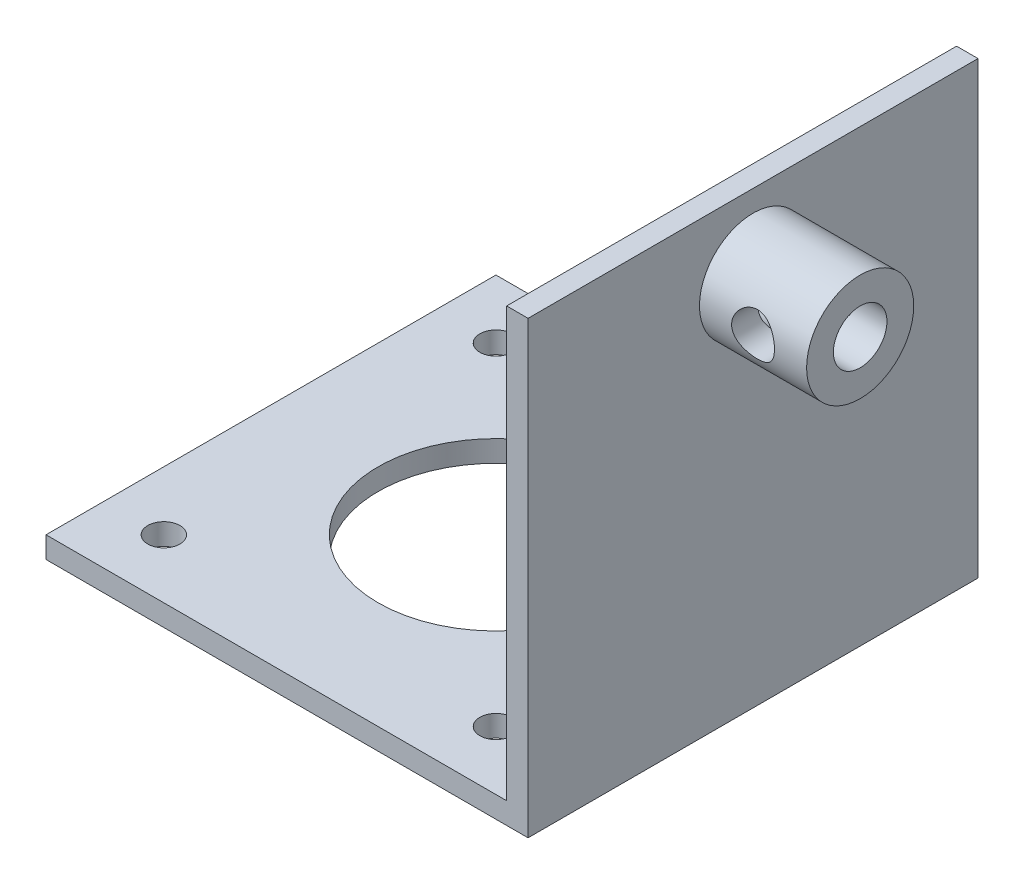
ISO-10303-21;
HEADER;
FILE_DESCRIPTION(('STEP AP214'),'2;1');
FILE_NAME('part.step','',(''),(''),'','','');
FILE_SCHEMA(('AUTOMOTIVE_DESIGN { 1 0 10303 214 1 1 1 1 }'));
ENDSEC;
DATA;
#1=APPLICATION_CONTEXT('core data for automotive mechanical design processes');
#2=APPLICATION_PROTOCOL_DEFINITION('international standard','automotive_design',2000,#1);
#3=PRODUCT_CONTEXT('',#1,'mechanical');
#4=PRODUCT('Part','Part','',(#3));
#5=PRODUCT_RELATED_PRODUCT_CATEGORY('part','',(#4));
#6=PRODUCT_DEFINITION_FORMATION('','',#4);
#7=PRODUCT_DEFINITION_CONTEXT('part definition',#1,'design');
#8=PRODUCT_DEFINITION('design','',#6,#7);
#9=PRODUCT_DEFINITION_SHAPE('','',#8);
#10=(LENGTH_UNIT() NAMED_UNIT(*) SI_UNIT(.MILLI.,.METRE.));
#11=(NAMED_UNIT(*) PLANE_ANGLE_UNIT() SI_UNIT($,.RADIAN.));
#12=(NAMED_UNIT(*) SI_UNIT($,.STERADIAN.) SOLID_ANGLE_UNIT());
#13=UNCERTAINTY_MEASURE_WITH_UNIT(LENGTH_MEASURE(1.E-05),#10,'distance_accuracy_value','');
#14=(GEOMETRIC_REPRESENTATION_CONTEXT(3) GLOBAL_UNCERTAINTY_ASSIGNED_CONTEXT((#13)) GLOBAL_UNIT_ASSIGNED_CONTEXT((#10,
#11,#12)) REPRESENTATION_CONTEXT('',''));
#15=CARTESIAN_POINT('',(0.,0.,0.));
#16=DIRECTION('',(0.,0.,1.));
#17=DIRECTION('',(1.,0.,0.));
#18=AXIS2_PLACEMENT_3D('',#15,#16,#17);
#19=CARTESIAN_POINT('',(0.,2.,0.));
#20=DIRECTION('',(0.,-1.,0.));
#21=DIRECTION('',(0.,0.,-1.));
#22=AXIS2_PLACEMENT_3D('',#19,#20,#21);
#23=PLANE('',#22);
#24=CARTESIAN_POINT('',(5.50000000000001,2.,-36.5));
#25=DIRECTION('',(0.,1.,0.));
#26=DIRECTION('',(0.,0.,1.));
#27=AXIS2_PLACEMENT_3D('',#24,#25,#26);
#28=CIRCLE('',#27,1.5);
#29=CARTESIAN_POINT('',(5.50000000000001,2.,-35.));
#30=VERTEX_POINT('',#29);
#31=EDGE_CURVE('E120',#30,#30,#28,.T.);
#32=ORIENTED_EDGE('',*,*,#31,.F.);
#33=EDGE_LOOP('',(#32));
#34=FACE_BOUND('',#33,.T.);
#35=CARTESIAN_POINT('',(21.,2.,-21.));
#36=DIRECTION('',(0.,1.,0.));
#37=DIRECTION('',(0.,0.,1.));
#38=AXIS2_PLACEMENT_3D('',#35,#36,#37);
#39=CIRCLE('',#38,11.);
#40=CARTESIAN_POINT('',(21.,2.,-10.));
#41=VERTEX_POINT('',#40);
#42=EDGE_CURVE('E257',#41,#41,#39,.T.);
#43=ORIENTED_EDGE('',*,*,#42,.F.);
#44=EDGE_LOOP('',(#43));
#45=FACE_BOUND('',#44,.T.);
#46=CARTESIAN_POINT('',(5.50000000000001,2.,-5.5));
#47=DIRECTION('',(0.,1.,0.));
#48=DIRECTION('',(0.,0.,1.));
#49=AXIS2_PLACEMENT_3D('',#46,#47,#48);
#50=CIRCLE('',#49,1.5);
#51=CARTESIAN_POINT('',(5.50000000000001,2.,-4.));
#52=VERTEX_POINT('',#51);
#53=EDGE_CURVE('E265',#52,#52,#50,.T.);
#54=ORIENTED_EDGE('',*,*,#53,.F.);
#55=EDGE_LOOP('',(#54));
#56=FACE_BOUND('',#55,.T.);
#57=CARTESIAN_POINT('',(36.5,2.,-5.5));
#58=DIRECTION('',(0.,1.,0.));
#59=DIRECTION('',(0.,0.,1.));
#60=AXIS2_PLACEMENT_3D('',#57,#58,#59);
#61=CIRCLE('',#60,1.5);
#62=CARTESIAN_POINT('',(36.5,2.,-4.));
#63=VERTEX_POINT('',#62);
#64=EDGE_CURVE('E273',#63,#63,#61,.T.);
#65=ORIENTED_EDGE('',*,*,#64,.F.);
#66=EDGE_LOOP('',(#65));
#67=FACE_BOUND('',#66,.T.);
#68=CARTESIAN_POINT('',(36.5,2.,-36.5));
#69=DIRECTION('',(0.,1.,0.));
#70=DIRECTION('',(0.,0.,1.));
#71=AXIS2_PLACEMENT_3D('',#68,#69,#70);
#72=CIRCLE('',#71,1.5);
#73=CARTESIAN_POINT('',(36.5,2.,-35.));
#74=VERTEX_POINT('',#73);
#75=EDGE_CURVE('E281',#74,#74,#72,.T.);
#76=ORIENTED_EDGE('',*,*,#75,.F.);
#77=EDGE_LOOP('',(#76));
#78=FACE_BOUND('',#77,.T.);
#79=DIRECTION('',(0.,0.,1.));
#80=VECTOR('',#79,1.);
#81=CARTESIAN_POINT('',(43.,2.,-42.));
#82=LINE('',#81,#80);
#83=CARTESIAN_POINT('',(43.,2.,-42.));
#84=VERTEX_POINT('',#83);
#85=CARTESIAN_POINT('',(43.,2.,0.));
#86=VERTEX_POINT('',#85);
#87=EDGE_CURVE('E64',#84,#86,#82,.T.);
#88=ORIENTED_EDGE('',*,*,#87,.F.);
#89=DIRECTION('',(-1.,0.,0.));
#90=VECTOR('',#89,1.);
#91=CARTESIAN_POINT('',(0.,2.,-42.));
#92=LINE('',#91,#90);
#93=CARTESIAN_POINT('',(0.,2.,-42.));
#94=VERTEX_POINT('',#93);
#95=EDGE_CURVE('E69',#84,#94,#92,.T.);
#96=ORIENTED_EDGE('',*,*,#95,.T.);
#97=DIRECTION('',(0.,0.,1.));
#98=VECTOR('',#97,1.);
#99=CARTESIAN_POINT('',(0.,2.,0.));
#100=LINE('',#99,#98);
#101=CARTESIAN_POINT('',(0.,2.,0.));
#102=VERTEX_POINT('',#101);
#103=EDGE_CURVE('E101',#94,#102,#100,.T.);
#104=ORIENTED_EDGE('',*,*,#103,.T.);
#105=DIRECTION('',(1.,0.,0.));
#106=VECTOR('',#105,1.);
#107=CARTESIAN_POINT('',(0.,2.,0.));
#108=LINE('',#107,#106);
#109=EDGE_CURVE('E292',#102,#86,#108,.T.);
#110=ORIENTED_EDGE('',*,*,#109,.T.);
#111=EDGE_LOOP('',(#88,#96,#104,#110));
#112=FACE_BOUND('',#111,.T.);
#113=ADVANCED_FACE('F41',(#34,#45,#56,#67,#78,#112),#23,.F.);
#114=CARTESIAN_POINT('',(0.,2.,0.));
#115=DIRECTION('',(1.,0.,0.));
#116=DIRECTION('',(0.,0.,-1.));
#117=AXIS2_PLACEMENT_3D('',#114,#115,#116);
#118=PLANE('',#117);
#119=DIRECTION('',(0.,0.,1.));
#120=VECTOR('',#119,1.);
#121=CARTESIAN_POINT('',(0.,0.,0.));
#122=LINE('',#121,#120);
#123=CARTESIAN_POINT('',(0.,0.,-42.));
#124=VERTEX_POINT('',#123);
#125=CARTESIAN_POINT('',(0.,0.,0.));
#126=VERTEX_POINT('',#125);
#127=EDGE_CURVE('E107',#124,#126,#122,.T.);
#128=ORIENTED_EDGE('',*,*,#127,.T.);
#129=DIRECTION('',(0.,-1.,0.));
#130=VECTOR('',#129,1.);
#131=CARTESIAN_POINT('',(0.,2.,0.));
#132=LINE('',#131,#130);
#133=EDGE_CURVE('E56',#102,#126,#132,.T.);
#134=ORIENTED_EDGE('',*,*,#133,.F.);
#135=ORIENTED_EDGE('',*,*,#103,.F.);
#136=DIRECTION('',(0.,-1.,0.));
#137=VECTOR('',#136,1.);
#138=CARTESIAN_POINT('',(0.,2.,-42.));
#139=LINE('',#138,#137);
#140=EDGE_CURVE('E92',#94,#124,#139,.T.);
#141=ORIENTED_EDGE('',*,*,#140,.T.);
#142=EDGE_LOOP('',(#128,#134,#135,#141));
#143=FACE_BOUND('',#142,.T.);
#144=ADVANCED_FACE('F43',(#143),#118,.F.);
#145=CARTESIAN_POINT('',(0.,2.,0.));
#146=DIRECTION('',(0.,0.,-1.));
#147=DIRECTION('',(-1.,0.,0.));
#148=AXIS2_PLACEMENT_3D('',#145,#146,#147);
#149=PLANE('',#148);
#150=DIRECTION('',(1.,0.,0.));
#151=VECTOR('',#150,1.);
#152=CARTESIAN_POINT('',(0.,0.,0.));
#153=LINE('',#152,#151);
#154=CARTESIAN_POINT('',(45.,0.,0.));
#155=VERTEX_POINT('',#154);
#156=EDGE_CURVE('E111',#126,#155,#153,.T.);
#157=ORIENTED_EDGE('',*,*,#156,.T.);
#158=DIRECTION('',(0.,-1.,0.));
#159=VECTOR('',#158,1.);
#160=CARTESIAN_POINT('',(45.,2.,0.));
#161=LINE('',#160,#159);
#162=CARTESIAN_POINT('',(45.,42.,0.));
#163=VERTEX_POINT('',#162);
#164=EDGE_CURVE('E129',#163,#155,#161,.T.);
#165=ORIENTED_EDGE('',*,*,#164,.F.);
#166=DIRECTION('',(1.,0.,0.));
#167=VECTOR('',#166,1.);
#168=CARTESIAN_POINT('',(43.,42.,0.));
#169=LINE('',#168,#167);
#170=CARTESIAN_POINT('',(43.,42.,0.));
#171=VERTEX_POINT('',#170);
#172=EDGE_CURVE('E245',#171,#163,#169,.T.);
#173=ORIENTED_EDGE('',*,*,#172,.F.);
#174=DIRECTION('',(0.,-1.,0.));
#175=VECTOR('',#174,1.);
#176=CARTESIAN_POINT('',(43.,42.,0.));
#177=LINE('',#176,#175);
#178=EDGE_CURVE('E247',#171,#86,#177,.T.);
#179=ORIENTED_EDGE('',*,*,#178,.T.);
#180=ORIENTED_EDGE('',*,*,#109,.F.);
#181=ORIENTED_EDGE('',*,*,#133,.T.);
#182=EDGE_LOOP('',(#157,#165,#173,#179,#180,#181));
#183=FACE_BOUND('',#182,.T.);
#184=ADVANCED_FACE('F210',(#183),#149,.F.);
#185=CARTESIAN_POINT('',(45.,2.,0.));
#186=DIRECTION('',(-1.,0.,0.));
#187=DIRECTION('',(0.,0.,1.));
#188=AXIS2_PLACEMENT_3D('',#185,#186,#187);
#189=PLANE('',#188);
#190=CARTESIAN_POINT('',(45.,35.,-21.));
#191=DIRECTION('',(-1.,0.,0.));
#192=DIRECTION('',(0.,0.,1.));
#193=AXIS2_PLACEMENT_3D('',#190,#191,#192);
#194=CIRCLE('',#193,5.);
#195=CARTESIAN_POINT('',(45.,35.,-16.));
#196=VERTEX_POINT('',#195);
#197=EDGE_CURVE('E11',#196,#196,#194,.F.);
#198=ORIENTED_EDGE('',*,*,#197,.F.);
#199=EDGE_LOOP('',(#198));
#200=FACE_BOUND('',#199,.T.);
#201=DIRECTION('',(0.,0.,-1.));
#202=VECTOR('',#201,1.);
#203=CARTESIAN_POINT('',(45.,0.,0.));
#204=LINE('',#203,#202);
#205=CARTESIAN_POINT('',(45.,0.,-42.));
#206=VERTEX_POINT('',#205);
#207=EDGE_CURVE('E102',#155,#206,#204,.T.);
#208=ORIENTED_EDGE('',*,*,#207,.T.);
#209=DIRECTION('',(0.,-1.,0.));
#210=VECTOR('',#209,1.);
#211=CARTESIAN_POINT('',(45.,2.,-42.));
#212=LINE('',#211,#210);
#213=CARTESIAN_POINT('',(45.,42.,-42.));
#214=VERTEX_POINT('',#213);
#215=EDGE_CURVE('E96',#214,#206,#212,.T.);
#216=ORIENTED_EDGE('',*,*,#215,.F.);
#217=DIRECTION('',(0.,0.,-1.));
#218=VECTOR('',#217,1.);
#219=CARTESIAN_POINT('',(45.,42.,0.));
#220=LINE('',#219,#218);
#221=EDGE_CURVE('E224',#163,#214,#220,.T.);
#222=ORIENTED_EDGE('',*,*,#221,.F.);
#223=ORIENTED_EDGE('',*,*,#164,.T.);
#224=EDGE_LOOP('',(#208,#216,#222,#223));
#225=FACE_BOUND('',#224,.T.);
#226=ADVANCED_FACE('F208',(#200,#225),#189,.F.);
#227=CARTESIAN_POINT('',(0.,2.,-42.));
#228=DIRECTION('',(0.,0.,1.));
#229=DIRECTION('',(1.,0.,0.));
#230=AXIS2_PLACEMENT_3D('',#227,#228,#229);
#231=PLANE('',#230);
#232=DIRECTION('',(-1.,0.,0.));
#233=VECTOR('',#232,1.);
#234=CARTESIAN_POINT('',(0.,0.,-42.));
#235=LINE('',#234,#233);
#236=EDGE_CURVE('E89',#206,#124,#235,.T.);
#237=ORIENTED_EDGE('',*,*,#236,.T.);
#238=ORIENTED_EDGE('',*,*,#140,.F.);
#239=ORIENTED_EDGE('',*,*,#95,.F.);
#240=DIRECTION('',(0.,-1.,0.));
#241=VECTOR('',#240,1.);
#242=CARTESIAN_POINT('',(43.,42.,-42.));
#243=LINE('',#242,#241);
#244=CARTESIAN_POINT('',(43.,42.,-42.));
#245=VERTEX_POINT('',#244);
#246=EDGE_CURVE('E252',#245,#84,#243,.T.);
#247=ORIENTED_EDGE('',*,*,#246,.F.);
#248=DIRECTION('',(-1.,0.,0.));
#249=VECTOR('',#248,1.);
#250=CARTESIAN_POINT('',(45.,42.,-42.));
#251=LINE('',#250,#249);
#252=EDGE_CURVE('E230',#214,#245,#251,.T.);
#253=ORIENTED_EDGE('',*,*,#252,.F.);
#254=ORIENTED_EDGE('',*,*,#215,.T.);
#255=EDGE_LOOP('',(#237,#238,#239,#247,#253,#254));
#256=FACE_BOUND('',#255,.T.);
#257=ADVANCED_FACE('F91',(#256),#231,.F.);
#258=CARTESIAN_POINT('',(0.,0.,0.));
#259=DIRECTION('',(0.,-1.,0.));
#260=DIRECTION('',(0.,0.,-1.));
#261=AXIS2_PLACEMENT_3D('',#258,#259,#260);
#262=PLANE('',#261);
#263=CARTESIAN_POINT('',(36.5,0.,-36.5));
#264=DIRECTION('',(0.,1.,0.));
#265=DIRECTION('',(0.,0.,1.));
#266=AXIS2_PLACEMENT_3D('',#263,#264,#265);
#267=CIRCLE('',#266,1.5);
#268=CARTESIAN_POINT('',(36.5,0.,-35.));
#269=VERTEX_POINT('',#268);
#270=EDGE_CURVE('E256',#269,#269,#267,.T.);
#271=ORIENTED_EDGE('',*,*,#270,.T.);
#272=EDGE_LOOP('',(#271));
#273=FACE_BOUND('',#272,.T.);
#274=CARTESIAN_POINT('',(36.5,0.,-5.5));
#275=DIRECTION('',(0.,1.,0.));
#276=DIRECTION('',(0.,0.,1.));
#277=AXIS2_PLACEMENT_3D('',#274,#275,#276);
#278=CIRCLE('',#277,1.5);
#279=CARTESIAN_POINT('',(36.5,0.,-4.));
#280=VERTEX_POINT('',#279);
#281=EDGE_CURVE('E277',#280,#280,#278,.T.);
#282=ORIENTED_EDGE('',*,*,#281,.T.);
#283=EDGE_LOOP('',(#282));
#284=FACE_BOUND('',#283,.T.);
#285=CARTESIAN_POINT('',(5.50000000000001,0.,-5.5));
#286=DIRECTION('',(0.,1.,0.));
#287=DIRECTION('',(0.,0.,1.));
#288=AXIS2_PLACEMENT_3D('',#285,#286,#287);
#289=CIRCLE('',#288,1.5);
#290=CARTESIAN_POINT('',(5.50000000000001,0.,-4.));
#291=VERTEX_POINT('',#290);
#292=EDGE_CURVE('E269',#291,#291,#289,.T.);
#293=ORIENTED_EDGE('',*,*,#292,.T.);
#294=EDGE_LOOP('',(#293));
#295=FACE_BOUND('',#294,.T.);
#296=CARTESIAN_POINT('',(21.,0.,-21.));
#297=DIRECTION('',(0.,1.,0.));
#298=DIRECTION('',(0.,0.,1.));
#299=AXIS2_PLACEMENT_3D('',#296,#297,#298);
#300=CIRCLE('',#299,11.);
#301=CARTESIAN_POINT('',(21.,0.,-10.));
#302=VERTEX_POINT('',#301);
#303=EDGE_CURVE('E261',#302,#302,#300,.T.);
#304=ORIENTED_EDGE('',*,*,#303,.T.);
#305=EDGE_LOOP('',(#304));
#306=FACE_BOUND('',#305,.T.);
#307=CARTESIAN_POINT('',(5.50000000000001,0.,-36.5));
#308=DIRECTION('',(0.,1.,0.));
#309=DIRECTION('',(0.,0.,1.));
#310=AXIS2_PLACEMENT_3D('',#307,#308,#309);
#311=CIRCLE('',#310,1.5);
#312=CARTESIAN_POINT('',(5.50000000000001,0.,-35.));
#313=VERTEX_POINT('',#312);
#314=EDGE_CURVE('E114',#313,#313,#311,.T.);
#315=ORIENTED_EDGE('',*,*,#314,.T.);
#316=EDGE_LOOP('',(#315));
#317=FACE_BOUND('',#316,.T.);
#318=ORIENTED_EDGE('',*,*,#127,.F.);
#319=ORIENTED_EDGE('',*,*,#236,.F.);
#320=ORIENTED_EDGE('',*,*,#207,.F.);
#321=ORIENTED_EDGE('',*,*,#156,.F.);
#322=EDGE_LOOP('',(#318,#319,#320,#321));
#323=FACE_BOUND('',#322,.T.);
#324=ADVANCED_FACE('F110',(#273,#284,#295,#306,#317,#323),#262,.T.);
#325=CARTESIAN_POINT('',(5.50000000000001,0.,-36.5));
#326=DIRECTION('',(0.,1.,0.));
#327=DIRECTION('',(0.,0.,1.));
#328=AXIS2_PLACEMENT_3D('',#325,#326,#327);
#329=CYLINDRICAL_SURFACE('',#328,1.5);
#330=ORIENTED_EDGE('',*,*,#314,.F.);
#331=EDGE_LOOP('',(#330));
#332=FACE_BOUND('',#331,.T.);
#333=ORIENTED_EDGE('',*,*,#31,.T.);
#334=EDGE_LOOP('',(#333));
#335=FACE_BOUND('',#334,.T.);
#336=ADVANCED_FACE('F185',(#332,#335),#329,.F.);
#337=CARTESIAN_POINT('',(21.,0.,-21.));
#338=DIRECTION('',(0.,1.,0.));
#339=DIRECTION('',(0.,0.,1.));
#340=AXIS2_PLACEMENT_3D('',#337,#338,#339);
#341=CYLINDRICAL_SURFACE('',#340,11.);
#342=ORIENTED_EDGE('',*,*,#303,.F.);
#343=EDGE_LOOP('',(#342));
#344=FACE_BOUND('',#343,.T.);
#345=ORIENTED_EDGE('',*,*,#42,.T.);
#346=EDGE_LOOP('',(#345));
#347=FACE_BOUND('',#346,.T.);
#348=ADVANCED_FACE('F181',(#344,#347),#341,.F.);
#349=CARTESIAN_POINT('',(5.50000000000001,0.,-5.5));
#350=DIRECTION('',(0.,1.,0.));
#351=DIRECTION('',(0.,0.,1.));
#352=AXIS2_PLACEMENT_3D('',#349,#350,#351);
#353=CYLINDRICAL_SURFACE('',#352,1.5);
#354=ORIENTED_EDGE('',*,*,#292,.F.);
#355=EDGE_LOOP('',(#354));
#356=FACE_BOUND('',#355,.T.);
#357=ORIENTED_EDGE('',*,*,#53,.T.);
#358=EDGE_LOOP('',(#357));
#359=FACE_BOUND('',#358,.T.);
#360=ADVANCED_FACE('F184',(#356,#359),#353,.F.);
#361=CARTESIAN_POINT('',(36.5,0.,-5.5));
#362=DIRECTION('',(0.,1.,0.));
#363=DIRECTION('',(0.,0.,1.));
#364=AXIS2_PLACEMENT_3D('',#361,#362,#363);
#365=CYLINDRICAL_SURFACE('',#364,1.5);
#366=ORIENTED_EDGE('',*,*,#281,.F.);
#367=EDGE_LOOP('',(#366));
#368=FACE_BOUND('',#367,.T.);
#369=ORIENTED_EDGE('',*,*,#64,.T.);
#370=EDGE_LOOP('',(#369));
#371=FACE_BOUND('',#370,.T.);
#372=ADVANCED_FACE('F189',(#368,#371),#365,.F.);
#373=CARTESIAN_POINT('',(36.5,0.,-36.5));
#374=DIRECTION('',(0.,1.,0.));
#375=DIRECTION('',(0.,0.,1.));
#376=AXIS2_PLACEMENT_3D('',#373,#374,#375);
#377=CYLINDRICAL_SURFACE('',#376,1.5);
#378=ORIENTED_EDGE('',*,*,#270,.F.);
#379=EDGE_LOOP('',(#378));
#380=FACE_BOUND('',#379,.T.);
#381=ORIENTED_EDGE('',*,*,#75,.T.);
#382=EDGE_LOOP('',(#381));
#383=FACE_BOUND('',#382,.T.);
#384=ADVANCED_FACE('F179',(#380,#383),#377,.F.);
#385=CARTESIAN_POINT('',(43.,42.,-42.));
#386=DIRECTION('',(1.,0.,0.));
#387=DIRECTION('',(0.,0.,-1.));
#388=AXIS2_PLACEMENT_3D('',#385,#386,#387);
#389=PLANE('',#388);
#390=ORIENTED_EDGE('',*,*,#87,.T.);
#391=ORIENTED_EDGE('',*,*,#178,.F.);
#392=DIRECTION('',(0.,0.,1.));
#393=VECTOR('',#392,1.);
#394=CARTESIAN_POINT('',(43.,42.,-42.));
#395=LINE('',#394,#393);
#396=EDGE_CURVE('E234',#245,#171,#395,.T.);
#397=ORIENTED_EDGE('',*,*,#396,.F.);
#398=ORIENTED_EDGE('',*,*,#246,.T.);
#399=EDGE_LOOP('',(#390,#391,#397,#398));
#400=FACE_BOUND('',#399,.T.);
#401=ADVANCED_FACE('F175',(#400),#389,.F.);
#402=CARTESIAN_POINT('',(0.,42.,0.));
#403=DIRECTION('',(0.,1.,0.));
#404=DIRECTION('',(0.,0.,1.));
#405=AXIS2_PLACEMENT_3D('',#402,#403,#404);
#406=PLANE('',#405);
#407=ORIENTED_EDGE('',*,*,#221,.T.);
#408=ORIENTED_EDGE('',*,*,#252,.T.);
#409=ORIENTED_EDGE('',*,*,#396,.T.);
#410=ORIENTED_EDGE('',*,*,#172,.T.);
#411=EDGE_LOOP('',(#407,#408,#409,#410));
#412=FACE_BOUND('',#411,.T.);
#413=ADVANCED_FACE('F170',(#412),#406,.T.);
#414=CARTESIAN_POINT('',(55.,35.,-21.));
#415=DIRECTION('',(-1.,0.,0.));
#416=DIRECTION('',(0.,0.,1.));
#417=AXIS2_PLACEMENT_3D('',#414,#415,#416);
#418=CYLINDRICAL_SURFACE('',#417,2.5);
#419=CARTESIAN_POINT('',(52.,35.,-18.5));
#420=CARTESIAN_POINT('',(51.9999924205671,34.9040031035611,-18.500007350526));
#421=CARTESIAN_POINT('',(51.9930305713364,34.8078668070353,-18.5055863158809));
#422=CARTESIAN_POINT('',(51.9656500599583,34.6186806345226,-18.527407306394));
#423=CARTESIAN_POINT('',(51.9452016287381,34.5256380656787,-18.5436729199962));
#424=CARTESIAN_POINT('',(51.8923217211049,34.3459050831755,-18.5853327818483));
#425=CARTESIAN_POINT('',(51.8599666485686,34.259178301872,-18.6106687985583));
#426=CARTESIAN_POINT('',(51.7848826565227,34.0930736763075,-18.668639890034));
#427=CARTESIAN_POINT('',(51.7421537041494,34.0136958553285,-18.7012749879225));
#428=CARTESIAN_POINT('',(51.6313716349689,33.836818763433,-18.7842433527105));
#429=CARTESIAN_POINT('',(51.5596810848259,33.7426323204789,-18.8367825139678));
#430=CARTESIAN_POINT('',(51.4027219342605,33.5695863217212,-18.9470780739697));
#431=CARTESIAN_POINT('',(51.3174142464966,33.4907723846685,-19.0048492779949));
#432=CARTESIAN_POINT('',(51.1332260159273,33.3478408104446,-19.1214399837016));
#433=CARTESIAN_POINT('',(51.0341532270239,33.2839736154278,-19.1802616909797));
#434=CARTESIAN_POINT('',(50.8234612174958,33.173531655864,-19.2911789011701));
#435=CARTESIAN_POINT('',(50.711885666112,33.126899006136,-19.3432965291083));
#436=CARTESIAN_POINT('',(50.526121048323,33.0691395622818,-19.4116434769907));
#437=CARTESIAN_POINT('',(50.4561882620197,33.0513452417934,-19.4337127222981));
#438=CARTESIAN_POINT('',(50.3127873158795,33.0232660320167,-19.4693011084417));
#439=CARTESIAN_POINT('',(50.239328326475,33.0129626811822,-19.4828412582026));
#440=CARTESIAN_POINT('',(50.089807481129,33.0006015985745,-19.499157659389));
#441=CARTESIAN_POINT('',(50.0137285151792,32.9986165438658,-19.5018390307344));
#442=CARTESIAN_POINT('',(49.8622951079673,33.0033051830031,-19.4956003769719));
#443=CARTESIAN_POINT('',(49.7869413342337,33.0099862048891,-19.4866705333976));
#444=CARTESIAN_POINT('',(49.6277776973873,33.0330469728806,-19.4567927870003));
#445=CARTESIAN_POINT('',(49.544491993946,33.0507819179438,-19.4341815795047));
#446=CARTESIAN_POINT('',(49.383464440463,33.0955545265115,-19.3800254006372));
#447=CARTESIAN_POINT('',(49.3057398434602,33.1226197435775,-19.3484540180136));
#448=CARTESIAN_POINT('',(49.119337893959,33.2002589780592,-19.2634388384059));
#449=CARTESIAN_POINT('',(49.0141973016958,33.2558511340449,-19.2068662703185));
#450=CARTESIAN_POINT('',(48.8162833222007,33.3836153250246,-19.0908621993932));
#451=CARTESIAN_POINT('',(48.7235282791565,33.4558115309753,-19.0314266295107));
#452=CARTESIAN_POINT('',(48.548725228595,33.618541816736,-18.9138724803156));
#453=CARTESIAN_POINT('',(48.4670280776943,33.7095129897303,-18.8558311073922));
#454=CARTESIAN_POINT('',(48.3199005005657,33.9080150892733,-18.7482812850501));
#455=CARTESIAN_POINT('',(48.2544264838828,34.0155003547989,-18.6987500817755));
#456=CARTESIAN_POINT('',(48.1594371525901,34.2122221856194,-18.6257541435668));
#457=CARTESIAN_POINT('',(48.1249954955609,34.2978222726707,-18.5988892877583));
#458=CARTESIAN_POINT('',(48.067873549012,34.4750860762628,-18.5540243588858));
#459=CARTESIAN_POINT('',(48.0451843950545,34.5667451637277,-18.5360176050309));
#460=CARTESIAN_POINT('',(48.0128614530642,34.754286766155,-18.5102966431479));
#461=CARTESIAN_POINT('',(48.003295875255,34.8501886927873,-18.5026362136633));
#462=CARTESIAN_POINT('',(47.9981409510237,35.0426080028675,-18.4985131729814));
#463=CARTESIAN_POINT('',(48.0025490011779,35.1391252683279,-18.5020484759094));
#464=CARTESIAN_POINT('',(48.0240828162477,35.3217466741554,-18.5192314135705));
#465=CARTESIAN_POINT('',(48.040149175139,35.4080608917565,-18.5320364759494));
#466=CARTESIAN_POINT('',(48.0828721811015,35.5763356742287,-18.5658248678653));
#467=CARTESIAN_POINT('',(48.1095319710966,35.6582949388569,-18.5868106244656));
#468=CARTESIAN_POINT('',(48.1741503717839,35.8212358775489,-18.6371015056867));
#469=CARTESIAN_POINT('',(48.2127057859563,35.901843619419,-18.6668408726313));
#470=CARTESIAN_POINT('',(48.2988621516328,36.0554100044833,-18.7321637727786));
#471=CARTESIAN_POINT('',(48.3464635542345,36.1283682659378,-18.7677475974158));
#472=CARTESIAN_POINT('',(48.4592243182968,36.2792523756914,-18.850063124776));
#473=CARTESIAN_POINT('',(48.526001690483,36.3555071897813,-18.8976303023178));
#474=CARTESIAN_POINT('',(48.6693869613709,36.4965368759753,-18.9955650204798));
#475=CARTESIAN_POINT('',(48.7460228368388,36.5612777772736,-19.045940290089));
#476=CARTESIAN_POINT('',(48.8764344432365,36.6556848793078,-19.1262586468286));
#477=CARTESIAN_POINT('',(48.9273605907533,36.6891374179265,-19.1564525631454));
#478=CARTESIAN_POINT('',(49.0326222614235,36.7515500192054,-19.2156458447887));
#479=CARTESIAN_POINT('',(49.0869595718807,36.7805076986897,-19.2446445704811));
#480=CARTESIAN_POINT('',(49.1988748402816,36.8335808995982,-19.30016171207));
#481=CARTESIAN_POINT('',(49.2564397672436,36.8577143168765,-19.3266890922516));
#482=CARTESIAN_POINT('',(49.3750089785039,36.9008848195863,-19.3758979013231));
#483=CARTESIAN_POINT('',(49.4360107375195,36.9199255893155,-19.3985821061957));
#484=CARTESIAN_POINT('',(49.5660867242377,36.9536016588908,-19.4398057977742));
#485=CARTESIAN_POINT('',(49.6354226649403,36.96779559725,-19.4579028328522));
#486=CARTESIAN_POINT('',(49.776837612738,36.9887890561937,-19.4850662840621));
#487=CARTESIAN_POINT('',(49.8489092204504,36.9956072307476,-19.4941554769248));
#488=CARTESIAN_POINT('',(49.994348705464,37.0013205871655,-19.5017526322028));
#489=CARTESIAN_POINT('',(50.0677214541541,37.0001731977979,-19.5002037408156));
#490=CARTESIAN_POINT('',(50.212984193023,36.9899651954421,-19.4866922830401));
#491=CARTESIAN_POINT('',(50.284871647326,36.9808920365379,-19.4747132065262));
#492=CARTESIAN_POINT('',(50.4446067743445,36.9520774575272,-19.4379292324392));
#493=CARTESIAN_POINT('',(50.531423082491,36.9300923040865,-19.4105074158063));
#494=CARTESIAN_POINT('',(50.6986334786895,36.8760817721744,-19.347110923576));
#495=CARTESIAN_POINT('',(50.7790077600366,36.8440268154257,-19.3111111278871));
#496=CARTESIAN_POINT('',(50.9121777220461,36.7809474631147,-19.2450884127557));
#497=CARTESIAN_POINT('',(50.9665191815182,36.7520236319042,-19.21611092675));
#498=CARTESIAN_POINT('',(51.0718382298172,36.6896473378247,-19.15692051261));
#499=CARTESIAN_POINT('',(51.1228145849511,36.6561932276591,-19.126707137885));
#500=CARTESIAN_POINT('',(51.2707794032987,36.5491843557072,-19.0356200224189));
#501=CARTESIAN_POINT('',(51.3627986866624,36.4689854164052,-18.974301915186));
#502=CARTESIAN_POINT('',(51.5333894648307,36.2900171885844,-18.8558172121289));
#503=CARTESIAN_POINT('',(51.6117702242367,36.1910196615766,-18.7987150803591));
#504=CARTESIAN_POINT('',(51.7155767294167,36.0299839989956,-18.7212534919548));
#505=CARTESIAN_POINT('',(51.7478684441351,35.9742554001998,-18.6968113189068));
#506=CARTESIAN_POINT('',(51.8073681009613,35.8588548286282,-18.651338845344));
#507=CARTESIAN_POINT('',(51.8345791544845,35.7991852998055,-18.6303064577109));
#508=CARTESIAN_POINT('',(51.8917800598956,35.6550377394244,-18.5857909448851));
#509=CARTESIAN_POINT('',(51.9194826718009,35.5691102395903,-18.5639710711238));
#510=CARTESIAN_POINT('',(51.9631576733877,35.3927130974279,-18.5294113502316));
#511=CARTESIAN_POINT('',(51.9791607887746,35.3022560241033,-18.5166477218313));
#512=CARTESIAN_POINT('',(51.9925630255603,35.17588093092,-18.505946216909));
#513=CARTESIAN_POINT('',(51.9953473787458,35.1408085528214,-18.5037208123657));
#514=CARTESIAN_POINT('',(51.9990674635275,35.0704970748919,-18.500746189821));
#515=CARTESIAN_POINT('',(52.0000027837899,35.0352579397118,-18.4999973002835));
#516=CARTESIAN_POINT('',(52.,35.,-18.5));
#517=B_SPLINE_CURVE_WITH_KNOTS('',3,(#419,#420,#421,#422,#423,#424,#425,#426,#427,#428,#429,
#430,#431,#432,#433,#434,#435,#436,#437,#438,#439,#440,#441,#442,#443,#444,#445,#446,#447,#448,
#449,#450,#451,#452,#453,#454,#455,#456,#457,#458,#459,#460,#461,#462,#463,#464,#465,#466,#467,
#468,#469,#470,#471,#472,#473,#474,#475,#476,#477,#478,#479,#480,#481,#482,#483,#484,#485,#486,
#487,#488,#489,#490,#491,#492,#493,#494,#495,#496,#497,#498,#499,#500,#501,#502,#503,#504,#505,
#506,#507,#508,#509,#510,#511,#512,#513,#514,#515,#516),.UNSPECIFIED.,.T.,.F.,(4,2,2,2,2,2,2,2,
2,2,2,2,2,2,2,2,2,2,2,2,2,2,2,2,2,2,2,2,2,2,2,2,2,2,2,2,2,2,2,2,2,2,2,2,2,2,2,2,4),(0.,
0.287836605992213,0.576310692639344,0.862965057250606,1.1496203299708,1.536078882001,
1.9236673818785,2.3173474176548,2.70969292925126,2.93534486341129,3.1604387740811,
3.38749528500758,3.61474392028821,3.87758630032008,4.14121163495702,4.53425748188297,
4.92787915886669,5.33198173288414,5.73498644040672,6.02213978124797,6.30907621738864,
6.59749843639961,6.88586692268768,7.15087004938156,7.4159518575957,7.69742753051562,
7.97891724351345,8.31365537249321,8.64936529970898,8.85316560745902,9.05707360380845,
9.26021055202073,9.46320013996576,9.68152133432591,9.89928907450679,10.1182215471167,
10.3375012031536,10.616933053181,10.8971934831172,11.101064001251,11.305008850691,
11.7129165318147,12.1261363563905,12.3324811048118,12.5386990694967,12.8161540735933,
13.0928777702215,13.1985714874516,13.3042887145431),.UNSPECIFIED.);
#518=CARTESIAN_POINT('',(52.,35.,-18.5));
#519=VERTEX_POINT('',#518);
#520=EDGE_CURVE('E161',#519,#519,#517,.T.);
#521=ORIENTED_EDGE('',*,*,#520,.F.);
#522=EDGE_LOOP('',(#521));
#523=FACE_BOUND('',#522,.T.);
#524=CARTESIAN_POINT('',(52.,35.,-23.5));
#525=CARTESIAN_POINT('',(51.9999924205671,35.0959968964389,-23.499992649474));
#526=CARTESIAN_POINT('',(51.9930305713364,35.1921331929647,-23.4944136841191));
#527=CARTESIAN_POINT('',(51.9656500599583,35.3813193654774,-23.472592693606));
#528=CARTESIAN_POINT('',(51.9452016287381,35.4743619343213,-23.4563270800038));
#529=CARTESIAN_POINT('',(51.8923217211049,35.6540949168245,-23.4146672181517));
#530=CARTESIAN_POINT('',(51.8599666485686,35.7408216981281,-23.3893312014417));
#531=CARTESIAN_POINT('',(51.7848826565227,35.9069263236926,-23.331360109966));
#532=CARTESIAN_POINT('',(51.7421537041494,35.9863041446715,-23.2987250120775));
#533=CARTESIAN_POINT('',(51.6313716349689,36.163181236567,-23.2157566472895));
#534=CARTESIAN_POINT('',(51.5596810848259,36.2573676795212,-23.1632174860322));
#535=CARTESIAN_POINT('',(51.4027219342605,36.4304136782788,-23.0529219260303));
#536=CARTESIAN_POINT('',(51.3174142464966,36.5092276153315,-22.9951507220051));
#537=CARTESIAN_POINT('',(51.1332260159273,36.6521591895554,-22.8785600162983));
#538=CARTESIAN_POINT('',(51.0341532270239,36.7160263845722,-22.8197383090203));
#539=CARTESIAN_POINT('',(50.8234612174958,36.826468344136,-22.7088210988299));
#540=CARTESIAN_POINT('',(50.711885666112,36.873100993864,-22.6567034708917));
#541=CARTESIAN_POINT('',(50.526121048323,36.9308604377182,-22.5883565230093));
#542=CARTESIAN_POINT('',(50.4561882620197,36.9486547582066,-22.5662872777019));
#543=CARTESIAN_POINT('',(50.3127873158795,36.9767339679833,-22.5306988915583));
#544=CARTESIAN_POINT('',(50.239328326475,36.9870373188178,-22.5171587417974));
#545=CARTESIAN_POINT('',(50.089807481129,36.9993984014255,-22.500842340611));
#546=CARTESIAN_POINT('',(50.0137285151792,37.0013834561342,-22.4981609692656));
#547=CARTESIAN_POINT('',(49.8622951079673,36.9966948169969,-22.5043996230281));
#548=CARTESIAN_POINT('',(49.7869413342337,36.9900137951109,-22.5133294666024));
#549=CARTESIAN_POINT('',(49.6277776973873,36.9669530271194,-22.5432072129997));
#550=CARTESIAN_POINT('',(49.544491993946,36.9492180820562,-22.5658184204953));
#551=CARTESIAN_POINT('',(49.383464440463,36.9044454734885,-22.6199745993628));
#552=CARTESIAN_POINT('',(49.3057398434602,36.8773802564225,-22.6515459819864));
#553=CARTESIAN_POINT('',(49.119337893959,36.7997410219408,-22.7365611615941));
#554=CARTESIAN_POINT('',(49.0141973016958,36.744148865955,-22.7931337296815));
#555=CARTESIAN_POINT('',(48.8162833222007,36.6163846749754,-22.9091378006068));
#556=CARTESIAN_POINT('',(48.7235282791565,36.5441884690247,-22.9685733704894));
#557=CARTESIAN_POINT('',(48.5487252285949,36.381458183264,-23.0861275196845));
#558=CARTESIAN_POINT('',(48.4670280776942,36.2904870102697,-23.1441688926078));
#559=CARTESIAN_POINT('',(48.3199005005657,36.0919849107267,-23.2517187149499));
#560=CARTESIAN_POINT('',(48.2544264838828,35.9844996452011,-23.3012499182245));
#561=CARTESIAN_POINT('',(48.1594371525901,35.7877778143806,-23.3742458564332));
#562=CARTESIAN_POINT('',(48.1249954955609,35.7021777273292,-23.4011107122417));
#563=CARTESIAN_POINT('',(48.067873549012,35.5249139237372,-23.4459756411142));
#564=CARTESIAN_POINT('',(48.0451843950545,35.4332548362723,-23.4639823949691));
#565=CARTESIAN_POINT('',(48.0128614530642,35.245713233845,-23.4897033568521));
#566=CARTESIAN_POINT('',(48.003295875255,35.1498113072127,-23.4973637863367));
#567=CARTESIAN_POINT('',(47.9981409510237,34.9573919971325,-23.5014868270186));
#568=CARTESIAN_POINT('',(48.0025490011779,34.8608747316721,-23.4979515240906));
#569=CARTESIAN_POINT('',(48.0240828162477,34.6782533258446,-23.4807685864295));
#570=CARTESIAN_POINT('',(48.040149175139,34.5919391082435,-23.4679635240506));
#571=CARTESIAN_POINT('',(48.0828721811015,34.4236643257713,-23.4341751321347));
#572=CARTESIAN_POINT('',(48.1095319710966,34.3417050611431,-23.4131893755344));
#573=CARTESIAN_POINT('',(48.1741503717839,34.1787641224511,-23.3628984943133));
#574=CARTESIAN_POINT('',(48.2127057859563,34.098156380581,-23.3331591273687));
#575=CARTESIAN_POINT('',(48.2988621516328,33.9445899955167,-23.2678362272214));
#576=CARTESIAN_POINT('',(48.3464635542345,33.8716317340621,-23.2322524025842));
#577=CARTESIAN_POINT('',(48.4592243182968,33.7207476243086,-23.149936875224));
#578=CARTESIAN_POINT('',(48.526001690483,33.6444928102188,-23.1023696976822));
#579=CARTESIAN_POINT('',(48.6693869613709,33.5034631240247,-23.0044349795202));
#580=CARTESIAN_POINT('',(48.7460228368388,33.4387222227264,-22.954059709911));
#581=CARTESIAN_POINT('',(48.8764344432365,33.3443151206922,-22.8737413531714));
#582=CARTESIAN_POINT('',(48.9273605907533,33.3108625820735,-22.8435474368546));
#583=CARTESIAN_POINT('',(49.0326222614235,33.2484499807946,-22.7843541552113));
#584=CARTESIAN_POINT('',(49.0869595718807,33.2194923013103,-22.7553554295189));
#585=CARTESIAN_POINT('',(49.1988748402816,33.1664191004018,-22.69983828793));
#586=CARTESIAN_POINT('',(49.2564397672436,33.1422856831235,-22.6733109077484));
#587=CARTESIAN_POINT('',(49.3750089785039,33.0991151804137,-22.6241020986769));
#588=CARTESIAN_POINT('',(49.4360107375195,33.0800744106845,-22.6014178938043));
#589=CARTESIAN_POINT('',(49.5660867242377,33.0463983411092,-22.5601942022258));
#590=CARTESIAN_POINT('',(49.6354226649403,33.03220440275,-22.5420971671478));
#591=CARTESIAN_POINT('',(49.776837612738,33.0112109438063,-22.5149337159379));
#592=CARTESIAN_POINT('',(49.8489092204504,33.0043927692524,-22.5058445230752));
#593=CARTESIAN_POINT('',(49.994348705464,32.9986794128345,-22.4982473677972));
#594=CARTESIAN_POINT('',(50.0677214541541,32.9998268022021,-22.4997962591844));
#595=CARTESIAN_POINT('',(50.2129841930231,33.010034804558,-22.5133077169599));
#596=CARTESIAN_POINT('',(50.284871647326,33.0191079634621,-22.5252867934738));
#597=CARTESIAN_POINT('',(50.4446067743445,33.0479225424728,-22.5620707675608));
#598=CARTESIAN_POINT('',(50.5314230824911,33.0699076959136,-22.5894925841937));
#599=CARTESIAN_POINT('',(50.6986334786896,33.1239182278257,-22.652889076424));
#600=CARTESIAN_POINT('',(50.7790077600367,33.1559731845743,-22.6888888721129));
#601=CARTESIAN_POINT('',(50.9121777220461,33.2190525368853,-22.7549115872443));
#602=CARTESIAN_POINT('',(50.9665191815182,33.2479763680959,-22.78388907325));
#603=CARTESIAN_POINT('',(51.0718382298172,33.3103526621753,-22.84307948739));
#604=CARTESIAN_POINT('',(51.1228145849511,33.3438067723409,-22.873292862115));
#605=CARTESIAN_POINT('',(51.2707794032988,33.4508156442928,-22.9643799775812));
#606=CARTESIAN_POINT('',(51.3627986866624,33.5310145835948,-23.025698084814));
#607=CARTESIAN_POINT('',(51.5333894648307,33.7099828114156,-23.1441827878711));
#608=CARTESIAN_POINT('',(51.6117702242367,33.8089803384234,-23.201284919641));
#609=CARTESIAN_POINT('',(51.7155767294167,33.9700160010045,-23.2787465080452));
#610=CARTESIAN_POINT('',(51.7478684441351,34.0257445998002,-23.3031886810932));
#611=CARTESIAN_POINT('',(51.8073681009613,34.1411451713719,-23.348661154656));
#612=CARTESIAN_POINT('',(51.8345791544845,34.2008147001945,-23.3696935422891));
#613=CARTESIAN_POINT('',(51.8917800598956,34.3449622605757,-23.414209055115));
#614=CARTESIAN_POINT('',(51.9194826718009,34.4308897604098,-23.4360289288763));
#615=CARTESIAN_POINT('',(51.9631576733877,34.6072869025722,-23.4705886497684));
#616=CARTESIAN_POINT('',(51.9791607887746,34.6977439758968,-23.4833522781687));
#617=CARTESIAN_POINT('',(51.9925630255603,34.82411906908,-23.494053783091));
#618=CARTESIAN_POINT('',(51.9953473787458,34.8591914471787,-23.4962791876343));
#619=CARTESIAN_POINT('',(51.9990674635275,34.9295029251081,-23.499253810179));
#620=CARTESIAN_POINT('',(52.0000027837899,34.9647420602883,-23.5000026997165));
#621=CARTESIAN_POINT('',(52.,35.,-23.5));
#622=B_SPLINE_CURVE_WITH_KNOTS('',3,(#524,#525,#526,#527,#528,#529,#530,#531,#532,#533,#534,
#535,#536,#537,#538,#539,#540,#541,#542,#543,#544,#545,#546,#547,#548,#549,#550,#551,#552,#553,
#554,#555,#556,#557,#558,#559,#560,#561,#562,#563,#564,#565,#566,#567,#568,#569,#570,#571,#572,
#573,#574,#575,#576,#577,#578,#579,#580,#581,#582,#583,#584,#585,#586,#587,#588,#589,#590,#591,
#592,#593,#594,#595,#596,#597,#598,#599,#600,#601,#602,#603,#604,#605,#606,#607,#608,#609,#610,
#611,#612,#613,#614,#615,#616,#617,#618,#619,#620,#621),.UNSPECIFIED.,.T.,.F.,(4,2,2,2,2,2,2,2,
2,2,2,2,2,2,2,2,2,2,2,2,2,2,2,2,2,2,2,2,2,2,2,2,2,2,2,2,2,2,2,2,2,2,2,2,2,2,2,2,4),(0.,
0.287836605992213,0.576310692639345,0.86296505725061,1.1496203299708,1.53607888200099,
1.92366738187851,2.31734741765481,2.70969292925127,2.93534486341129,3.1604387740811,
3.38749528500758,3.61474392028822,3.87758630032009,4.14121163495704,4.53425748188299,
4.92787915886672,5.33198173288417,5.73498644040673,6.02213978124799,6.30907621738864,
6.59749843639962,6.88586692268769,7.15087004938156,7.41595185759571,7.69742753051564,
7.97891724351346,8.31365537249321,8.64936529970898,8.85316560745902,9.05707360380846,
9.26021055202074,9.46320013996577,9.68152133432592,9.8992890745068,10.1182215471167,
10.3375012031536,10.616933053181,10.8971934831172,11.101064001251,11.3050088506911,
11.7129165318147,12.1261363563906,12.3324811048119,12.5386990694967,12.8161540735934,
13.0928777702215,13.1985714874516,13.3042887145431),.UNSPECIFIED.);
#623=CARTESIAN_POINT('',(52.,35.,-23.5));
#624=VERTEX_POINT('',#623);
#625=EDGE_CURVE('E155',#624,#624,#622,.T.);
#626=ORIENTED_EDGE('',*,*,#625,.F.);
#627=EDGE_LOOP('',(#626));
#628=FACE_BOUND('',#627,.T.);
#629=CARTESIAN_POINT('',(55.,35.,-21.));
#630=DIRECTION('',(1.,0.,0.));
#631=DIRECTION('',(0.,0.,-1.));
#632=AXIS2_PLACEMENT_3D('',#629,#630,#631);
#633=CIRCLE('',#632,2.5);
#634=CARTESIAN_POINT('',(55.,35.,-23.5));
#635=VERTEX_POINT('',#634);
#636=EDGE_CURVE('E328',#635,#635,#633,.T.);
#637=ORIENTED_EDGE('',*,*,#636,.T.);
#638=EDGE_LOOP('',(#637));
#639=FACE_BOUND('',#638,.T.);
#640=CARTESIAN_POINT('',(45.,35.,-21.));
#641=DIRECTION('',(1.,0.,0.));
#642=DIRECTION('',(0.,0.,-1.));
#643=AXIS2_PLACEMENT_3D('',#640,#641,#642);
#644=CIRCLE('',#643,2.5);
#645=CARTESIAN_POINT('',(45.,35.,-23.5));
#646=VERTEX_POINT('',#645);
#647=EDGE_CURVE('E239',#646,#646,#644,.T.);
#648=ORIENTED_EDGE('',*,*,#647,.F.);
#649=EDGE_LOOP('',(#648));
#650=FACE_BOUND('',#649,.T.);
#651=ADVANCED_FACE('F166',(#523,#628,#639,#650),#418,.F.);
#652=CARTESIAN_POINT('',(55.,35.,-21.));
#653=DIRECTION('',(-1.,0.,0.));
#654=DIRECTION('',(0.,0.,1.));
#655=AXIS2_PLACEMENT_3D('',#652,#653,#654);
#656=CYLINDRICAL_SURFACE('',#655,5.);
#657=CARTESIAN_POINT('',(52.,35.,-16.));
#658=CARTESIAN_POINT('',(51.9999901481763,34.8925069945571,-16.0000072877292));
#659=CARTESIAN_POINT('',(51.9912822479116,34.7848274359093,-16.0035070569307));
#660=CARTESIAN_POINT('',(51.9567522964788,34.5725035195821,-16.0171654689936));
#661=CARTESIAN_POINT('',(51.9308837209139,34.4678682224388,-16.0273422130112));
#662=CARTESIAN_POINT('',(51.8631239219412,34.2650460772726,-16.0532579078688));
#663=CARTESIAN_POINT('',(51.8212851537833,34.166839338383,-16.0689786363593));
#664=CARTESIAN_POINT('',(51.7229808266735,33.9789280296716,-16.1044338920392));
#665=CARTESIAN_POINT('',(51.6665203450811,33.889220523249,-16.1241670254194));
#666=CARTESIAN_POINT('',(51.5377645014391,33.7164989924296,-16.1666911382958));
#667=CARTESIAN_POINT('',(51.4648933437597,33.6339377274498,-16.1895770307081));
#668=CARTESIAN_POINT('',(51.3065999965232,33.4818249952153,-16.2353942309381));
#669=CARTESIAN_POINT('',(51.2211717027883,33.4122798928665,-16.2583255554621));
#670=CARTESIAN_POINT('',(51.0355719297577,33.2851254327071,-16.3027720820286));
#671=CARTESIAN_POINT('',(50.9349135139768,33.2281850188045,-16.3241788403505));
#672=CARTESIAN_POINT('',(50.72446360158,33.1322452809629,-16.3616635281321));
#673=CARTESIAN_POINT('',(50.6146764721516,33.0932374357142,-16.3777439875582));
#674=CARTESIAN_POINT('',(50.3942876664079,33.0361011766041,-16.4017364233918));
#675=CARTESIAN_POINT('',(50.2839487644238,33.0171060341944,-16.409985796444));
#676=CARTESIAN_POINT('',(50.0613650016927,32.99782703836,-16.4183599595086));
#677=CARTESIAN_POINT('',(49.949121105375,32.9975339836868,-16.4184887447723));
#678=CARTESIAN_POINT('',(49.734243328542,33.0150106324955,-16.4108949972001));
#679=CARTESIAN_POINT('',(49.631484285591,33.0315246856949,-16.4037182496155));
#680=CARTESIAN_POINT('',(49.4303404439933,33.0800531197022,-16.3832381239216));
#681=CARTESIAN_POINT('',(49.3319564118897,33.1120702051954,-16.3699336767833));
#682=CARTESIAN_POINT('',(49.139982163804,33.1913052674489,-16.3384051491147));
#683=CARTESIAN_POINT('',(49.0465307609453,33.2388201376847,-16.3200862071921));
#684=CARTESIAN_POINT('',(48.8685841836384,33.3474935392678,-16.2806188361011));
#685=CARTESIAN_POINT('',(48.7840923905972,33.4086571948992,-16.2594693454315));
#686=CARTESIAN_POINT('',(48.619590271198,33.5484494005456,-16.2147326325773));
#687=CARTESIAN_POINT('',(48.540431270554,33.6280625370294,-16.1910833502385));
#688=CARTESIAN_POINT('',(48.396315521998,33.7996855725698,-16.1454017504172));
#689=CARTESIAN_POINT('',(48.3313616025897,33.8916979346656,-16.1233697555468));
#690=CARTESIAN_POINT('',(48.2163825525842,34.0879223473942,-16.0828531873545));
#691=CARTESIAN_POINT('',(48.1666777188029,34.1923395086535,-16.0644472990459));
#692=CARTESIAN_POINT('',(48.0858321389219,34.4089762345171,-16.0338517167124));
#693=CARTESIAN_POINT('',(48.0546819624426,34.5211918031503,-16.0216588653762));
#694=CARTESIAN_POINT('',(48.0135517045803,34.7431041123922,-16.0054386049309));
#695=CARTESIAN_POINT('',(48.0024275457464,34.8525567060145,-16.0009705416649));
#696=CARTESIAN_POINT('',(47.9982868994714,35.0718453098078,-15.9993152148937));
#697=CARTESIAN_POINT('',(48.0052657184525,35.1816812132239,-16.0021260641771));
#698=CARTESIAN_POINT('',(48.036291752552,35.393432739122,-16.0144243293625));
#699=CARTESIAN_POINT('',(48.059557980351,35.4954824917755,-16.0236060865448));
#700=CARTESIAN_POINT('',(48.1214357083098,35.6941354280608,-16.047405585945));
#701=CARTESIAN_POINT('',(48.1600491796687,35.7907379102249,-16.0620240264347));
#702=CARTESIAN_POINT('',(48.2527849396799,35.9790787858167,-16.0958340522919));
#703=CARTESIAN_POINT('',(48.3073454720431,36.0705780227554,-16.115151840202));
#704=CARTESIAN_POINT('',(48.4299403239056,36.2434435912466,-16.1562663525448));
#705=CARTESIAN_POINT('',(48.4979800429226,36.3248058407611,-16.1780640688973));
#706=CARTESIAN_POINT('',(48.6508700129496,36.4807230430288,-16.2235488236189));
#707=CARTESIAN_POINT('',(48.7365335415062,36.5544739338061,-16.2472655857495));
#708=CARTESIAN_POINT('',(48.9194400830094,36.6867511974137,-16.2925832708287));
#709=CARTESIAN_POINT('',(49.0166850003399,36.7452750613375,-16.3141838447349));
#710=CARTESIAN_POINT('',(49.2214616945941,36.8458075019316,-16.3528570009229));
#711=CARTESIAN_POINT('',(49.3290839992123,36.8876505945345,-16.3698836911521));
#712=CARTESIAN_POINT('',(49.5507336517152,36.9522962197053,-16.3967632652207));
#713=CARTESIAN_POINT('',(49.6647562058124,36.9751128052693,-16.40662144304));
#714=CARTESIAN_POINT('',(49.8871279017745,36.9997156172784,-16.4172824070007));
#715=CARTESIAN_POINT('',(49.9952948395934,37.0028970823029,-16.4186857899183));
#716=CARTESIAN_POINT('',(50.2105448577133,36.9918031592775,-16.413851639669));
#717=CARTESIAN_POINT('',(50.3176280739026,36.9775299879138,-16.4076150767521));
#718=CARTESIAN_POINT('',(50.523332189855,36.9330713661536,-16.3887335092098));
#719=CARTESIAN_POINT('',(50.622120274433,36.903537493571,-16.3763516817255));
#720=CARTESIAN_POINT('',(50.8133786296135,36.830005448491,-16.346759987673));
#721=CARTESIAN_POINT('',(50.9058471468998,36.7860032813938,-16.3295487879399));
#722=CARTESIAN_POINT('',(51.0876096192708,36.6818727627597,-16.2910139039551));
#723=CARTESIAN_POINT('',(51.1764186701305,36.6209653351595,-16.2695111768676));
#724=CARTESIAN_POINT('',(51.3429933172037,36.4858921192715,-16.2253619562776));
#725=CARTESIAN_POINT('',(51.4207555721283,36.4117223348181,-16.2027151195159));
#726=CARTESIAN_POINT('',(51.5682028532636,36.2465055062725,-16.1570643291261));
#727=CARTESIAN_POINT('',(51.6370373068981,36.1546760011461,-16.1341324203781));
#728=CARTESIAN_POINT('',(51.7583370426216,35.9599003202858,-16.0919959328628));
#729=CARTESIAN_POINT('',(51.8107947121525,35.8569490045472,-16.0727930890709));
#730=CARTESIAN_POINT('',(51.8966222151903,35.6447380624952,-16.0406028518414));
#731=CARTESIAN_POINT('',(51.9303293235603,35.5356316182197,-16.0275063694497));
#732=CARTESIAN_POINT('',(51.9786391209543,35.3128765462812,-16.0085569379063));
#733=CARTESIAN_POINT('',(51.9933024367439,35.1992435258589,-16.0026810050436));
#734=CARTESIAN_POINT('',(51.9993953809783,35.0569122978909,-16.0002410049586));
#735=CARTESIAN_POINT('',(52.0000026086292,35.0284626887408,-15.9999980703082));
#736=CARTESIAN_POINT('',(52.,35.,-16.));
#737=B_SPLINE_CURVE_WITH_KNOTS('',3,(#657,#658,#659,#660,#661,#662,#663,#664,#665,#666,#667,
#668,#669,#670,#671,#672,#673,#674,#675,#676,#677,#678,#679,#680,#681,#682,#683,#684,#685,#686,
#687,#688,#689,#690,#691,#692,#693,#694,#695,#696,#697,#698,#699,#700,#701,#702,#703,#704,#705,
#706,#707,#708,#709,#710,#711,#712,#713,#714,#715,#716,#717,#718,#719,#720,#721,#722,#723,#724,
#725,#726,#727,#728,#729,#730,#731,#732,#733,#734,#735,#736),.UNSPECIFIED.,.T.,.F.,(4,2,2,2,2,2,
2,2,2,2,2,2,2,2,2,2,2,2,2,2,2,2,2,2,2,2,2,2,2,2,2,2,2,2,2,2,2,2,2,4),(0.,0.322402987893074,
0.645683636007937,0.967911457471579,1.29002753567985,1.62597381700398,1.96208394934412,
2.31315258819217,2.66405423118268,2.99904105308829,3.33386306340489,3.64538328401373,
3.95695787256048,4.27489126298816,4.59294421938183,4.93558349186557,5.27829092839733,
5.62776913162808,5.97706956113791,6.30569184528009,6.63422893570084,6.94800455564368,
7.26182048993798,7.58523513398264,7.9087795949897,8.25368474624416,8.59864669043749,
8.9469504514083,9.29499672645936,9.61799673392751,9.94095572563048,10.2511431854877,
10.5614163580516,10.8894546805669,11.217592013484,11.5670042353384,11.9165786364054,
12.2596430101332,12.6016125240434,12.686980458968),.UNSPECIFIED.);
#738=CARTESIAN_POINT('',(52.,35.,-16.));
#739=VERTEX_POINT('',#738);
#740=EDGE_CURVE('E45',#739,#739,#737,.T.);
#741=ORIENTED_EDGE('',*,*,#740,.T.);
#742=EDGE_LOOP('',(#741));
#743=FACE_BOUND('',#742,.T.);
#744=CARTESIAN_POINT('',(52.,35.,-26.));
#745=CARTESIAN_POINT('',(51.9999901481763,35.1074930054429,-25.9999927122709));
#746=CARTESIAN_POINT('',(51.9912822479116,35.2151725640907,-25.9964929430693));
#747=CARTESIAN_POINT('',(51.9567522964788,35.4274964804179,-25.9828345310064));
#748=CARTESIAN_POINT('',(51.9308837209139,35.5321317775613,-25.9726577869888));
#749=CARTESIAN_POINT('',(51.8631239219412,35.7349539227274,-25.9467420921312));
#750=CARTESIAN_POINT('',(51.8212851537833,35.833160661617,-25.9310213636407));
#751=CARTESIAN_POINT('',(51.7229808266735,36.0210719703284,-25.8955661079608));
#752=CARTESIAN_POINT('',(51.6665203450811,36.110779476751,-25.8758329745806));
#753=CARTESIAN_POINT('',(51.5377645014391,36.2835010075704,-25.8333088617042));
#754=CARTESIAN_POINT('',(51.4648933437597,36.3660622725502,-25.8104229692919));
#755=CARTESIAN_POINT('',(51.3065999965232,36.5181750047847,-25.7646057690619));
#756=CARTESIAN_POINT('',(51.2211717027883,36.5877201071335,-25.7416744445379));
#757=CARTESIAN_POINT('',(51.0355719297577,36.7148745672929,-25.6972279179714));
#758=CARTESIAN_POINT('',(50.9349135139768,36.7718149811955,-25.6758211596495));
#759=CARTESIAN_POINT('',(50.72446360158,36.8677547190372,-25.6383364718679));
#760=CARTESIAN_POINT('',(50.6146764721516,36.9067625642858,-25.6222560124418));
#761=CARTESIAN_POINT('',(50.3942876664079,36.9638988233959,-25.5982635766082));
#762=CARTESIAN_POINT('',(50.2839487644238,36.9828939658057,-25.590014203556));
#763=CARTESIAN_POINT('',(50.0613650016927,37.00217296164,-25.5816400404914));
#764=CARTESIAN_POINT('',(49.949121105375,37.0024660163132,-25.5815112552277));
#765=CARTESIAN_POINT('',(49.734243328542,36.9849893675046,-25.5891050027999));
#766=CARTESIAN_POINT('',(49.631484285591,36.9684753143051,-25.5962817503845));
#767=CARTESIAN_POINT('',(49.4303404439933,36.9199468802978,-25.6167618760784));
#768=CARTESIAN_POINT('',(49.3319564118897,36.8879297948046,-25.6300663232167));
#769=CARTESIAN_POINT('',(49.1399821638039,36.8086947325511,-25.6615948508853));
#770=CARTESIAN_POINT('',(49.0465307609453,36.7611798623153,-25.6799137928079));
#771=CARTESIAN_POINT('',(48.8685841836384,36.6525064607322,-25.7193811638989));
#772=CARTESIAN_POINT('',(48.7840923905972,36.5913428051008,-25.7405306545685));
#773=CARTESIAN_POINT('',(48.619590271198,36.4515505994544,-25.7852673674227));
#774=CARTESIAN_POINT('',(48.540431270554,36.3719374629706,-25.8089166497615));
#775=CARTESIAN_POINT('',(48.396315521998,36.2003144274302,-25.8545982495828));
#776=CARTESIAN_POINT('',(48.3313616025897,36.1083020653344,-25.8766302444532));
#777=CARTESIAN_POINT('',(48.2163825525842,35.9120776526058,-25.9171468126455));
#778=CARTESIAN_POINT('',(48.1666777188029,35.8076604913465,-25.9355527009542));
#779=CARTESIAN_POINT('',(48.0858321389219,35.5910237654829,-25.9661482832876));
#780=CARTESIAN_POINT('',(48.0546819624426,35.4788081968497,-25.9783411346238));
#781=CARTESIAN_POINT('',(48.0135517045803,35.2568958876078,-25.9945613950691));
#782=CARTESIAN_POINT('',(48.0024275457464,35.1474432939855,-25.9990294583351));
#783=CARTESIAN_POINT('',(47.9982868994714,34.9281546901922,-26.0006847851063));
#784=CARTESIAN_POINT('',(48.0052657184525,34.8183187867761,-25.9978739358229));
#785=CARTESIAN_POINT('',(48.036291752552,34.606567260878,-25.9855756706375));
#786=CARTESIAN_POINT('',(48.059557980351,34.5045175082245,-25.9763939134552));
#787=CARTESIAN_POINT('',(48.1214357083098,34.3058645719392,-25.952594414055));
#788=CARTESIAN_POINT('',(48.1600491796687,34.2092620897752,-25.9379759735653));
#789=CARTESIAN_POINT('',(48.2527849396799,34.0209212141833,-25.9041659477081));
#790=CARTESIAN_POINT('',(48.3073454720431,33.9294219772446,-25.884848159798));
#791=CARTESIAN_POINT('',(48.4299403239056,33.7565564087534,-25.8437336474552));
#792=CARTESIAN_POINT('',(48.4979800429226,33.6751941592389,-25.8219359311027));
#793=CARTESIAN_POINT('',(48.6508700129496,33.5192769569712,-25.7764511763811));
#794=CARTESIAN_POINT('',(48.7365335415062,33.4455260661939,-25.7527344142505));
#795=CARTESIAN_POINT('',(48.9194400830094,33.3132488025863,-25.7074167291713));
#796=CARTESIAN_POINT('',(49.0166850003399,33.2547249386625,-25.6858161552651));
#797=CARTESIAN_POINT('',(49.2214616945941,33.1541924980684,-25.6471429990771));
#798=CARTESIAN_POINT('',(49.3290839992123,33.1123494054655,-25.6301163088479));
#799=CARTESIAN_POINT('',(49.5507336517152,33.0477037802947,-25.6032367347793));
#800=CARTESIAN_POINT('',(49.6647562058124,33.0248871947307,-25.59337855696));
#801=CARTESIAN_POINT('',(49.8871279017745,33.0002843827216,-25.5827175929993));
#802=CARTESIAN_POINT('',(49.9952948395934,32.9971029176971,-25.5813142100817));
#803=CARTESIAN_POINT('',(50.2105448577133,33.0081968407225,-25.586148360331));
#804=CARTESIAN_POINT('',(50.3176280739026,33.0224700120862,-25.5923849232479));
#805=CARTESIAN_POINT('',(50.523332189855,33.0669286338463,-25.6112664907902));
#806=CARTESIAN_POINT('',(50.622120274433,33.096462506429,-25.6236483182745));
#807=CARTESIAN_POINT('',(50.8133786296135,33.169994551509,-25.653240012327));
#808=CARTESIAN_POINT('',(50.9058471468998,33.2139967186062,-25.6704512120601));
#809=CARTESIAN_POINT('',(51.0876096192708,33.3181272372403,-25.7089860960449));
#810=CARTESIAN_POINT('',(51.1764186701305,33.3790346648405,-25.7304888231324));
#811=CARTESIAN_POINT('',(51.3429933172037,33.5141078807285,-25.7746380437224));
#812=CARTESIAN_POINT('',(51.4207555721283,33.5882776651819,-25.7972848804841));
#813=CARTESIAN_POINT('',(51.5682028532636,33.7534944937275,-25.8429356708739));
#814=CARTESIAN_POINT('',(51.6370373068981,33.8453239988539,-25.8658675796219));
#815=CARTESIAN_POINT('',(51.7583370426216,34.0400996797142,-25.9080040671372));
#816=CARTESIAN_POINT('',(51.8107947121525,34.1430509954528,-25.9272069109291));
#817=CARTESIAN_POINT('',(51.8966222151903,34.3552619375048,-25.9593971481586));
#818=CARTESIAN_POINT('',(51.9303293235603,34.4643683817803,-25.9724936305503));
#819=CARTESIAN_POINT('',(51.9786391209543,34.6871234537188,-25.9914430620937));
#820=CARTESIAN_POINT('',(51.9933024367439,34.8007564741411,-25.9973189949564));
#821=CARTESIAN_POINT('',(51.9993953809783,34.9430877021091,-25.9997589950414));
#822=CARTESIAN_POINT('',(52.0000026086292,34.9715373112592,-26.0000019296918));
#823=CARTESIAN_POINT('',(52.,35.,-26.));
#824=B_SPLINE_CURVE_WITH_KNOTS('',3,(#744,#745,#746,#747,#748,#749,#750,#751,#752,#753,#754,
#755,#756,#757,#758,#759,#760,#761,#762,#763,#764,#765,#766,#767,#768,#769,#770,#771,#772,#773,
#774,#775,#776,#777,#778,#779,#780,#781,#782,#783,#784,#785,#786,#787,#788,#789,#790,#791,#792,
#793,#794,#795,#796,#797,#798,#799,#800,#801,#802,#803,#804,#805,#806,#807,#808,#809,#810,#811,
#812,#813,#814,#815,#816,#817,#818,#819,#820,#821,#822,#823),.UNSPECIFIED.,.T.,.F.,(4,2,2,2,2,2,
2,2,2,2,2,2,2,2,2,2,2,2,2,2,2,2,2,2,2,2,2,2,2,2,2,2,2,2,2,2,2,2,2,4),(0.,0.322402987893074,
0.645683636007937,0.967911457471579,1.29002753567985,1.62597381700397,1.96208394934411,
2.31315258819217,2.66405423118268,2.99904105308829,3.33386306340489,3.64538328401373,
3.95695787256049,4.27489126298817,4.59294421938185,4.93558349186557,5.27829092839734,
5.62776913162808,5.97706956113791,6.30569184528009,6.63422893570084,6.94800455564368,
7.26182048993798,7.58523513398264,7.9087795949897,8.25368474624415,8.59864669043749,
8.9469504514083,9.29499672645935,9.61799673392751,9.94095572563047,10.2511431854877,
10.5614163580516,10.8894546805669,11.217592013484,11.5670042353384,11.9165786364054,
12.2596430101332,12.6016125240434,12.686980458968),.UNSPECIFIED.);
#825=CARTESIAN_POINT('',(52.,35.,-26.));
#826=VERTEX_POINT('',#825);
#827=EDGE_CURVE('E134',#826,#826,#824,.T.);
#828=ORIENTED_EDGE('',*,*,#827,.T.);
#829=EDGE_LOOP('',(#828));
#830=FACE_BOUND('',#829,.T.);
#831=CARTESIAN_POINT('',(55.,35.,-21.));
#832=DIRECTION('',(1.,0.,0.));
#833=DIRECTION('',(0.,0.,-1.));
#834=AXIS2_PLACEMENT_3D('',#831,#832,#833);
#835=CIRCLE('',#834,5.);
#836=CARTESIAN_POINT('',(55.,35.,-26.));
#837=VERTEX_POINT('',#836);
#838=EDGE_CURVE('E236',#837,#837,#835,.T.);
#839=ORIENTED_EDGE('',*,*,#838,.F.);
#840=EDGE_LOOP('',(#839));
#841=FACE_BOUND('',#840,.T.);
#842=ORIENTED_EDGE('',*,*,#197,.T.);
#843=EDGE_LOOP('',(#842));
#844=FACE_BOUND('',#843,.T.);
#845=ADVANCED_FACE('F140',(#743,#830,#841,#844),#656,.T.);
#846=CARTESIAN_POINT('',(55.,0.,0.));
#847=DIRECTION('',(1.,0.,0.));
#848=DIRECTION('',(0.,0.,-1.));
#849=AXIS2_PLACEMENT_3D('',#846,#847,#848);
#850=PLANE('',#849);
#851=ORIENTED_EDGE('',*,*,#636,.F.);
#852=EDGE_LOOP('',(#851));
#853=FACE_BOUND('',#852,.T.);
#854=ORIENTED_EDGE('',*,*,#838,.T.);
#855=EDGE_LOOP('',(#854));
#856=FACE_BOUND('',#855,.T.);
#857=ADVANCED_FACE('F149',(#853,#856),#850,.T.);
#858=ORIENTED_EDGE('',*,*,#647,.T.);
#859=EDGE_LOOP('',(#858));
#860=FACE_BOUND('',#859,.T.);
#861=ADVANCED_FACE('F212',(#860),#189,.F.);
#862=CARTESIAN_POINT('',(50.,35.,-42.));
#863=DIRECTION('',(0.,0.,1.));
#864=DIRECTION('',(1.,0.,0.));
#865=AXIS2_PLACEMENT_3D('',#862,#863,#864);
#866=CYLINDRICAL_SURFACE('',#865,2.);
#867=ORIENTED_EDGE('',*,*,#625,.T.);
#868=EDGE_LOOP('',(#867));
#869=FACE_BOUND('',#868,.T.);
#870=ORIENTED_EDGE('',*,*,#827,.F.);
#871=EDGE_LOOP('',(#870));
#872=FACE_BOUND('',#871,.T.);
#873=ADVANCED_FACE('F147',(#869,#872),#866,.F.);
#874=ORIENTED_EDGE('',*,*,#520,.T.);
#875=EDGE_LOOP('',(#874));
#876=FACE_BOUND('',#875,.T.);
#877=ORIENTED_EDGE('',*,*,#740,.F.);
#878=EDGE_LOOP('',(#877));
#879=FACE_BOUND('',#878,.T.);
#880=ADVANCED_FACE('F144',(#876,#879),#866,.F.);
#881=CLOSED_SHELL('',(#113,#144,#184,#226,#257,#324,#336,#348,#360,#372,#384,#401,#413,#651,
#845,#857,#861,#873,#880));
#882=MANIFOLD_SOLID_BREP('B2',#881);
#883=ADVANCED_BREP_SHAPE_REPRESENTATION('',(#18,#882),#14);
#884=SHAPE_DEFINITION_REPRESENTATION(#9,#883);
ENDSEC;
END-ISO-10303-21;
